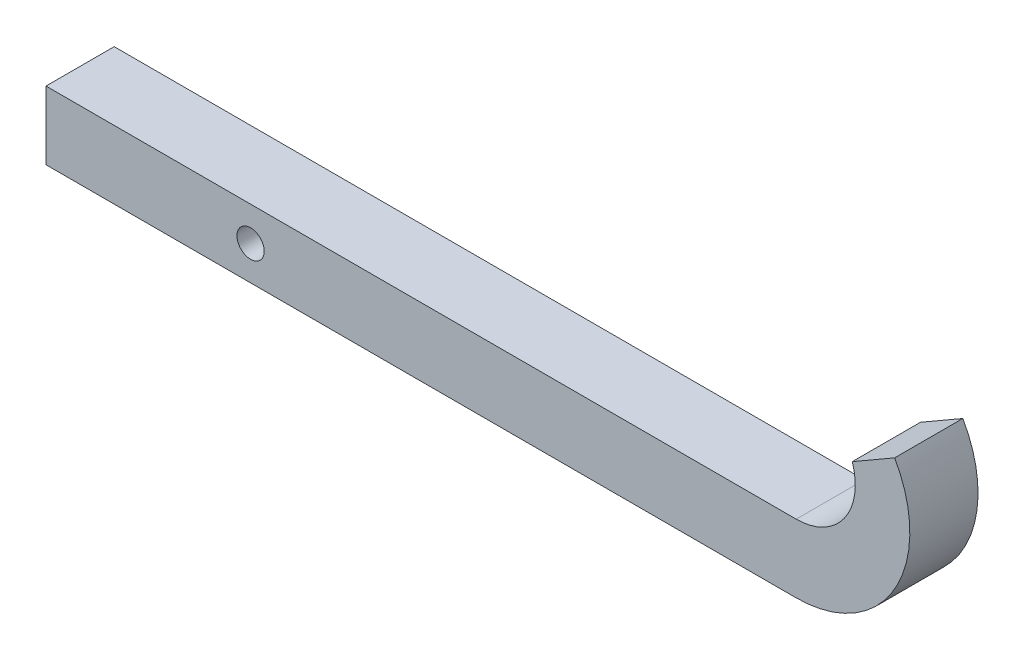
ISO-10303-21;
HEADER;
FILE_DESCRIPTION(('STEP AP214'),'2;1');
FILE_NAME('part.step','',(''),(''),'','','');
FILE_SCHEMA(('AUTOMOTIVE_DESIGN { 1 0 10303 214 1 1 1 1 }'));
ENDSEC;
DATA;
#1=APPLICATION_CONTEXT('core data for automotive mechanical design processes');
#2=APPLICATION_PROTOCOL_DEFINITION('international standard','automotive_design',2000,#1);
#3=PRODUCT_CONTEXT('',#1,'mechanical');
#4=PRODUCT('Part','Part','',(#3));
#5=PRODUCT_RELATED_PRODUCT_CATEGORY('part','',(#4));
#6=PRODUCT_DEFINITION_FORMATION('','',#4);
#7=PRODUCT_DEFINITION_CONTEXT('part definition',#1,'design');
#8=PRODUCT_DEFINITION('design','',#6,#7);
#9=PRODUCT_DEFINITION_SHAPE('','',#8);
#10=(LENGTH_UNIT() NAMED_UNIT(*) SI_UNIT(.MILLI.,.METRE.));
#11=(NAMED_UNIT(*) PLANE_ANGLE_UNIT() SI_UNIT($,.RADIAN.));
#12=(NAMED_UNIT(*) SI_UNIT($,.STERADIAN.) SOLID_ANGLE_UNIT());
#13=UNCERTAINTY_MEASURE_WITH_UNIT(LENGTH_MEASURE(1.E-05),#10,'distance_accuracy_value','');
#14=(GEOMETRIC_REPRESENTATION_CONTEXT(3) GLOBAL_UNCERTAINTY_ASSIGNED_CONTEXT((#13)) GLOBAL_UNIT_ASSIGNED_CONTEXT((#10,
#11,#12)) REPRESENTATION_CONTEXT('',''));
#15=CARTESIAN_POINT('',(0.,0.,0.));
#16=DIRECTION('',(0.,0.,1.));
#17=DIRECTION('',(1.,0.,0.));
#18=AXIS2_PLACEMENT_3D('',#15,#16,#17);
#19=CARTESIAN_POINT('',(0.,25.,7.5));
#20=DIRECTION('',(0.,0.,-1.));
#21=DIRECTION('',(-1.,0.,0.));
#22=AXIS2_PLACEMENT_3D('',#19,#20,#21);
#23=CYLINDRICAL_SURFACE('',#22,25.);
#24=CARTESIAN_POINT('',(0.,25.,-7.5));
#25=DIRECTION('',(0.,0.,1.));
#26=DIRECTION('',(1.,0.,0.));
#27=AXIS2_PLACEMENT_3D('',#24,#25,#26);
#28=CIRCLE('',#27,25.);
#29=CARTESIAN_POINT('',(0.,0.,-7.5));
#30=VERTEX_POINT('',#29);
#31=CARTESIAN_POINT('',(21.650635094611,37.5,-7.5));
#32=VERTEX_POINT('',#31);
#33=EDGE_CURVE('E122',#30,#32,#28,.T.);
#34=ORIENTED_EDGE('',*,*,#33,.T.);
#35=DIRECTION('',(0.,0.,-1.));
#36=VECTOR('',#35,1.);
#37=CARTESIAN_POINT('',(21.650635094611,37.5,7.5));
#38=LINE('',#37,#36);
#39=CARTESIAN_POINT('',(21.650635094611,37.5,7.5));
#40=VERTEX_POINT('',#39);
#41=EDGE_CURVE('E11',#40,#32,#38,.T.);
#42=ORIENTED_EDGE('',*,*,#41,.F.);
#43=CARTESIAN_POINT('',(0.,25.,7.5));
#44=DIRECTION('',(0.,0.,1.));
#45=DIRECTION('',(1.,0.,0.));
#46=AXIS2_PLACEMENT_3D('',#43,#44,#45);
#47=CIRCLE('',#46,25.);
#48=CARTESIAN_POINT('',(0.,0.,7.5));
#49=VERTEX_POINT('',#48);
#50=EDGE_CURVE('E133',#49,#40,#47,.T.);
#51=ORIENTED_EDGE('',*,*,#50,.F.);
#52=DIRECTION('',(0.,0.,-1.));
#53=VECTOR('',#52,1.);
#54=CARTESIAN_POINT('',(0.,0.,7.5));
#55=LINE('',#54,#53);
#56=EDGE_CURVE('E118',#49,#30,#55,.T.);
#57=ORIENTED_EDGE('',*,*,#56,.T.);
#58=EDGE_LOOP('',(#34,#42,#51,#57));
#59=FACE_BOUND('',#58,.T.);
#60=ADVANCED_FACE('F38',(#59),#23,.T.);
#61=CARTESIAN_POINT('',(12.3302438421318,32.1188696014285,7.5));
#62=DIRECTION('',(0.500000000000001,-0.866025403784438,0.));
#63=DIRECTION('',(0.866025403784438,0.500000000000001,0.));
#64=AXIS2_PLACEMENT_3D('',#61,#62,#63);
#65=PLANE('',#64);
#66=DIRECTION('',(-0.866025403784438,-0.500000000000001,0.));
#67=VECTOR('',#66,1.);
#68=CARTESIAN_POINT('',(12.3302438421318,32.1188696014285,-7.5));
#69=LINE('',#68,#67);
#70=CARTESIAN_POINT('',(12.3302438421318,32.1188696014285,-7.5));
#71=VERTEX_POINT('',#70);
#72=EDGE_CURVE('E125',#32,#71,#69,.T.);
#73=ORIENTED_EDGE('',*,*,#72,.T.);
#74=DIRECTION('',(0.,0.,-1.));
#75=VECTOR('',#74,1.);
#76=CARTESIAN_POINT('',(12.3302438421318,32.1188696014285,7.5));
#77=LINE('',#76,#75);
#78=CARTESIAN_POINT('',(12.3302438421318,32.1188696014285,7.5));
#79=VERTEX_POINT('',#78);
#80=EDGE_CURVE('E46',#79,#71,#77,.T.);
#81=ORIENTED_EDGE('',*,*,#80,.F.);
#82=DIRECTION('',(-0.866025403784438,-0.500000000000001,0.));
#83=VECTOR('',#82,1.);
#84=CARTESIAN_POINT('',(12.3302438421318,32.1188696014285,7.5));
#85=LINE('',#84,#83);
#86=EDGE_CURVE('E91',#40,#79,#85,.T.);
#87=ORIENTED_EDGE('',*,*,#86,.F.);
#88=ORIENTED_EDGE('',*,*,#41,.T.);
#89=EDGE_LOOP('',(#73,#81,#87,#88));
#90=FACE_BOUND('',#89,.T.);
#91=ADVANCED_FACE('F158',(#90),#65,.F.);
#92=CARTESIAN_POINT('',(0.,28.,7.5));
#93=DIRECTION('',(0.,0.,-1.));
#94=DIRECTION('',(-1.,0.,0.));
#95=AXIS2_PLACEMENT_3D('',#92,#93,#94);
#96=CYLINDRICAL_SURFACE('',#95,13.);
#97=CARTESIAN_POINT('',(0.,28.,-7.5));
#98=DIRECTION('',(0.,0.,-1.));
#99=DIRECTION('',(1.,0.,0.));
#100=AXIS2_PLACEMENT_3D('',#97,#98,#99);
#101=CIRCLE('',#100,13.);
#102=CARTESIAN_POINT('',(0.,15.,-7.5));
#103=VERTEX_POINT('',#102);
#104=EDGE_CURVE('E128',#71,#103,#101,.T.);
#105=ORIENTED_EDGE('',*,*,#104,.T.);
#106=DIRECTION('',(0.,0.,-1.));
#107=VECTOR('',#106,1.);
#108=CARTESIAN_POINT('',(0.,15.,7.5));
#109=LINE('',#108,#107);
#110=CARTESIAN_POINT('',(0.,15.,7.5));
#111=VERTEX_POINT('',#110);
#112=EDGE_CURVE('E113',#111,#103,#109,.T.);
#113=ORIENTED_EDGE('',*,*,#112,.F.);
#114=CARTESIAN_POINT('',(0.,28.,7.5));
#115=DIRECTION('',(0.,0.,-1.));
#116=DIRECTION('',(1.,0.,0.));
#117=AXIS2_PLACEMENT_3D('',#114,#115,#116);
#118=CIRCLE('',#117,13.);
#119=EDGE_CURVE('E104',#79,#111,#118,.T.);
#120=ORIENTED_EDGE('',*,*,#119,.F.);
#121=ORIENTED_EDGE('',*,*,#80,.T.);
#122=EDGE_LOOP('',(#105,#113,#120,#121));
#123=FACE_BOUND('',#122,.T.);
#124=ADVANCED_FACE('F139',(#123),#96,.F.);
#125=CARTESIAN_POINT('',(0.,15.,7.5));
#126=DIRECTION('',(0.,-1.,0.));
#127=DIRECTION('',(1.,0.,0.));
#128=AXIS2_PLACEMENT_3D('',#125,#126,#127);
#129=PLANE('',#128);
#130=DIRECTION('',(-1.,0.,0.));
#131=VECTOR('',#130,1.);
#132=CARTESIAN_POINT('',(0.,15.,-7.5));
#133=LINE('',#132,#131);
#134=CARTESIAN_POINT('',(-165.,15.,-7.5));
#135=VERTEX_POINT('',#134);
#136=EDGE_CURVE('E112',#103,#135,#133,.T.);
#137=ORIENTED_EDGE('',*,*,#136,.T.);
#138=DIRECTION('',(0.,0.,-1.));
#139=VECTOR('',#138,1.);
#140=CARTESIAN_POINT('',(-165.,15.,7.5));
#141=LINE('',#140,#139);
#142=CARTESIAN_POINT('',(-165.,15.,7.5));
#143=VERTEX_POINT('',#142);
#144=EDGE_CURVE('E109',#143,#135,#141,.T.);
#145=ORIENTED_EDGE('',*,*,#144,.F.);
#146=DIRECTION('',(-1.,0.,0.));
#147=VECTOR('',#146,1.);
#148=CARTESIAN_POINT('',(0.,15.,7.5));
#149=LINE('',#148,#147);
#150=EDGE_CURVE('E98',#111,#143,#149,.T.);
#151=ORIENTED_EDGE('',*,*,#150,.F.);
#152=ORIENTED_EDGE('',*,*,#112,.T.);
#153=EDGE_LOOP('',(#137,#145,#151,#152));
#154=FACE_BOUND('',#153,.T.);
#155=ADVANCED_FACE('F110',(#154),#129,.F.);
#156=CARTESIAN_POINT('',(-165.,0.,7.5));
#157=DIRECTION('',(1.,0.,0.));
#158=DIRECTION('',(0.,0.,-1.));
#159=AXIS2_PLACEMENT_3D('',#156,#157,#158);
#160=PLANE('',#159);
#161=DIRECTION('',(0.,-1.,0.));
#162=VECTOR('',#161,1.);
#163=CARTESIAN_POINT('',(-165.,0.,-7.5));
#164=LINE('',#163,#162);
#165=CARTESIAN_POINT('',(-165.,0.,-7.5));
#166=VERTEX_POINT('',#165);
#167=EDGE_CURVE('E77',#135,#166,#164,.T.);
#168=ORIENTED_EDGE('',*,*,#167,.T.);
#169=DIRECTION('',(0.,0.,-1.));
#170=VECTOR('',#169,1.);
#171=CARTESIAN_POINT('',(-165.,0.,7.5));
#172=LINE('',#171,#170);
#173=CARTESIAN_POINT('',(-165.,0.,7.5));
#174=VERTEX_POINT('',#173);
#175=EDGE_CURVE('E114',#174,#166,#172,.T.);
#176=ORIENTED_EDGE('',*,*,#175,.F.);
#177=DIRECTION('',(0.,-1.,0.));
#178=VECTOR('',#177,1.);
#179=CARTESIAN_POINT('',(-165.,0.,7.5));
#180=LINE('',#179,#178);
#181=EDGE_CURVE('E102',#143,#174,#180,.T.);
#182=ORIENTED_EDGE('',*,*,#181,.F.);
#183=ORIENTED_EDGE('',*,*,#144,.T.);
#184=EDGE_LOOP('',(#168,#176,#182,#183));
#185=FACE_BOUND('',#184,.T.);
#186=ADVANCED_FACE('F116',(#185),#160,.F.);
#187=CARTESIAN_POINT('',(0.,0.,7.5));
#188=DIRECTION('',(0.,1.,0.));
#189=DIRECTION('',(-1.,0.,0.));
#190=AXIS2_PLACEMENT_3D('',#187,#188,#189);
#191=PLANE('',#190);
#192=DIRECTION('',(1.,0.,0.));
#193=VECTOR('',#192,1.);
#194=CARTESIAN_POINT('',(0.,0.,-7.5));
#195=LINE('',#194,#193);
#196=EDGE_CURVE('E83',#166,#30,#195,.T.);
#197=ORIENTED_EDGE('',*,*,#196,.T.);
#198=ORIENTED_EDGE('',*,*,#56,.F.);
#199=DIRECTION('',(1.,0.,0.));
#200=VECTOR('',#199,1.);
#201=CARTESIAN_POINT('',(0.,0.,7.5));
#202=LINE('',#201,#200);
#203=EDGE_CURVE('E54',#174,#49,#202,.T.);
#204=ORIENTED_EDGE('',*,*,#203,.F.);
#205=ORIENTED_EDGE('',*,*,#175,.T.);
#206=EDGE_LOOP('',(#197,#198,#204,#205));
#207=FACE_BOUND('',#206,.T.);
#208=ADVANCED_FACE('F146',(#207),#191,.F.);
#209=CARTESIAN_POINT('',(0.,25.,7.5));
#210=DIRECTION('',(0.,0.,1.));
#211=DIRECTION('',(1.,0.,0.));
#212=AXIS2_PLACEMENT_3D('',#209,#210,#211);
#213=PLANE('',#212);
#214=CARTESIAN_POINT('',(-120.,7.5,7.5));
#215=DIRECTION('',(0.,0.,1.));
#216=DIRECTION('',(1.,0.,0.));
#217=AXIS2_PLACEMENT_3D('',#214,#215,#216);
#218=CIRCLE('',#217,2.99999999999999);
#219=CARTESIAN_POINT('',(-117.,7.5,7.5));
#220=VERTEX_POINT('',#219);
#221=EDGE_CURVE('E213',#220,#220,#218,.T.);
#222=ORIENTED_EDGE('',*,*,#221,.F.);
#223=EDGE_LOOP('',(#222));
#224=FACE_BOUND('',#223,.T.);
#225=ORIENTED_EDGE('',*,*,#50,.T.);
#226=ORIENTED_EDGE('',*,*,#86,.T.);
#227=ORIENTED_EDGE('',*,*,#119,.T.);
#228=ORIENTED_EDGE('',*,*,#150,.T.);
#229=ORIENTED_EDGE('',*,*,#181,.T.);
#230=ORIENTED_EDGE('',*,*,#203,.T.);
#231=EDGE_LOOP('',(#225,#226,#227,#228,#229,#230));
#232=FACE_BOUND('',#231,.T.);
#233=ADVANCED_FACE('F100',(#224,#232),#213,.T.);
#234=CARTESIAN_POINT('',(0.,25.,-7.5));
#235=DIRECTION('',(0.,0.,1.));
#236=DIRECTION('',(1.,0.,0.));
#237=AXIS2_PLACEMENT_3D('',#234,#235,#236);
#238=PLANE('',#237);
#239=CARTESIAN_POINT('',(-120.,7.5,-7.5));
#240=DIRECTION('',(0.,0.,1.));
#241=DIRECTION('',(1.,0.,0.));
#242=AXIS2_PLACEMENT_3D('',#239,#240,#241);
#243=CIRCLE('',#242,2.99999999999999);
#244=CARTESIAN_POINT('',(-117.,7.5,-7.5));
#245=VERTEX_POINT('',#244);
#246=EDGE_CURVE('E126',#245,#245,#243,.T.);
#247=ORIENTED_EDGE('',*,*,#246,.T.);
#248=EDGE_LOOP('',(#247));
#249=FACE_BOUND('',#248,.T.);
#250=ORIENTED_EDGE('',*,*,#33,.F.);
#251=ORIENTED_EDGE('',*,*,#196,.F.);
#252=ORIENTED_EDGE('',*,*,#167,.F.);
#253=ORIENTED_EDGE('',*,*,#136,.F.);
#254=ORIENTED_EDGE('',*,*,#104,.F.);
#255=ORIENTED_EDGE('',*,*,#72,.F.);
#256=EDGE_LOOP('',(#250,#251,#252,#253,#254,#255));
#257=FACE_BOUND('',#256,.T.);
#258=ADVANCED_FACE('F142',(#249,#257),#238,.F.);
#259=CARTESIAN_POINT('',(-120.,7.5,-7.5));
#260=DIRECTION('',(0.,0.,1.));
#261=DIRECTION('',(1.,0.,0.));
#262=AXIS2_PLACEMENT_3D('',#259,#260,#261);
#263=CYLINDRICAL_SURFACE('',#262,2.99999999999999);
#264=ORIENTED_EDGE('',*,*,#246,.F.);
#265=EDGE_LOOP('',(#264));
#266=FACE_BOUND('',#265,.T.);
#267=ORIENTED_EDGE('',*,*,#221,.T.);
#268=EDGE_LOOP('',(#267));
#269=FACE_BOUND('',#268,.T.);
#270=ADVANCED_FACE('F195',(#266,#269),#263,.F.);
#271=CLOSED_SHELL('',(#60,#91,#124,#155,#186,#208,#233,#258,#270));
#272=MANIFOLD_SOLID_BREP('B2',#271);
#273=ADVANCED_BREP_SHAPE_REPRESENTATION('',(#18,#272),#14);
#274=SHAPE_DEFINITION_REPRESENTATION(#9,#273);
ENDSEC;
END-ISO-10303-21;
